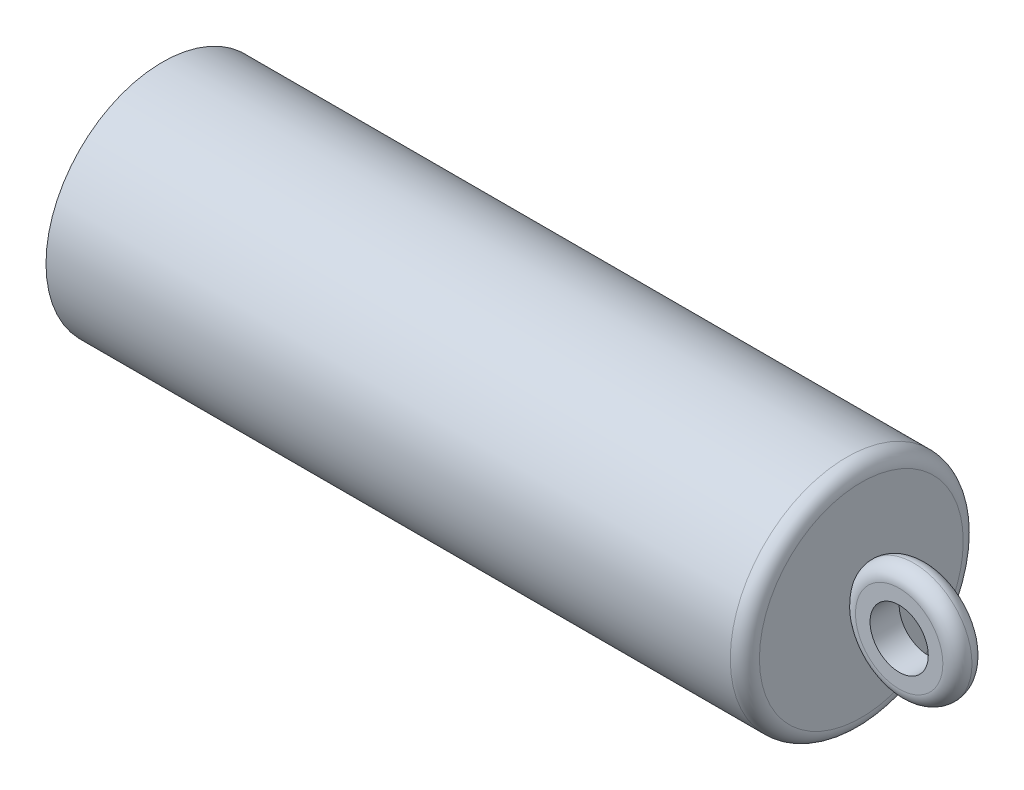
ISO-10303-21;
HEADER;
FILE_DESCRIPTION(('STEP AP214'),'2;1');
FILE_NAME('part.step','',(''),(''),'','','');
FILE_SCHEMA(('AUTOMOTIVE_DESIGN { 1 0 10303 214 1 1 1 1 }'));
ENDSEC;
DATA;
#1=APPLICATION_CONTEXT('core data for automotive mechanical design processes');
#2=APPLICATION_PROTOCOL_DEFINITION('international standard','automotive_design',2000,#1);
#3=PRODUCT_CONTEXT('',#1,'mechanical');
#4=PRODUCT('Part','Part','',(#3));
#5=PRODUCT_RELATED_PRODUCT_CATEGORY('part','',(#4));
#6=PRODUCT_DEFINITION_FORMATION('','',#4);
#7=PRODUCT_DEFINITION_CONTEXT('part definition',#1,'design');
#8=PRODUCT_DEFINITION('design','',#6,#7);
#9=PRODUCT_DEFINITION_SHAPE('','',#8);
#10=(LENGTH_UNIT() NAMED_UNIT(*) SI_UNIT(.MILLI.,.METRE.));
#11=(NAMED_UNIT(*) PLANE_ANGLE_UNIT() SI_UNIT($,.RADIAN.));
#12=(NAMED_UNIT(*) SI_UNIT($,.STERADIAN.) SOLID_ANGLE_UNIT());
#13=UNCERTAINTY_MEASURE_WITH_UNIT(LENGTH_MEASURE(1.E-05),#10,'distance_accuracy_value','');
#14=(GEOMETRIC_REPRESENTATION_CONTEXT(3) GLOBAL_UNCERTAINTY_ASSIGNED_CONTEXT((#13)) GLOBAL_UNIT_ASSIGNED_CONTEXT((#10,
#11,#12)) REPRESENTATION_CONTEXT('',''));
#15=CARTESIAN_POINT('',(0.,0.,0.));
#16=DIRECTION('',(0.,0.,1.));
#17=DIRECTION('',(1.,0.,0.));
#18=AXIS2_PLACEMENT_3D('',#15,#16,#17);
#19=CARTESIAN_POINT('',(76.2,0.,0.));
#20=DIRECTION('',(1.,0.,0.));
#21=DIRECTION('',(0.,0.,-1.));
#22=AXIS2_PLACEMENT_3D('',#19,#20,#21);
#23=PLANE('',#22);
#24=CARTESIAN_POINT('',(76.2,0.,0.));
#25=DIRECTION('',(1.,0.,0.));
#26=DIRECTION('',(0.,0.,-1.));
#27=AXIS2_PLACEMENT_3D('',#24,#25,#26);
#28=CIRCLE('',#27,11.1125);
#29=CARTESIAN_POINT('',(76.2,0.,-11.1125));
#30=VERTEX_POINT('',#29);
#31=EDGE_CURVE('E57',#30,#30,#28,.T.);
#32=ORIENTED_EDGE('',*,*,#31,.T.);
#33=EDGE_LOOP('',(#32));
#34=FACE_BOUND('',#33,.T.);
#35=CARTESIAN_POINT('',(76.2,2.76790082914832,0.));
#36=CARTESIAN_POINT('',(76.2,2.76799560286683,-0.0415321876434481));
#37=CARTESIAN_POINT('',(76.2,2.76416781145411,-0.0829644315915624));
#38=CARTESIAN_POINT('',(76.2,2.74948889415519,-0.164226781417078));
#39=CARTESIAN_POINT('',(76.2,2.73869624027987,-0.204067319753549));
#40=CARTESIAN_POINT('',(76.2,2.71092263365801,-0.281363831155004));
#41=CARTESIAN_POINT('',(76.2,2.69395832136879,-0.318825901160992));
#42=CARTESIAN_POINT('',(76.2,2.65489162105821,-0.391020376587939));
#43=CARTESIAN_POINT('',(76.2,2.63277833716207,-0.425746781469106));
#44=CARTESIAN_POINT('',(76.2,2.56964424453132,-0.512552843849354));
#45=CARTESIAN_POINT('',(76.2,2.52533675661912,-0.562238950960838));
#46=CARTESIAN_POINT('',(76.2,2.42954221481172,-0.654131737730224));
#47=CARTESIAN_POINT('',(76.2,2.37803556003017,-0.696317258350174));
#48=CARTESIAN_POINT('',(76.2,2.27861936488134,-0.767991133814682));
#49=CARTESIAN_POINT('',(76.2,2.23138481151806,-0.79843418670752));
#50=CARTESIAN_POINT('',(76.2,2.13444642103697,-0.855130162307362));
#51=CARTESIAN_POINT('',(76.2,2.08474077585683,-0.881379955894404));
#52=CARTESIAN_POINT('',(76.2,1.93294942020491,-0.954655981478679));
#53=CARTESIAN_POINT('',(76.2,1.8282159172078,-0.996190899989502));
#54=CARTESIAN_POINT('',(76.2,1.61061781601046,-1.06953658436386));
#55=CARTESIAN_POINT('',(76.2,1.49759685622132,-1.10085845222127));
#56=CARTESIAN_POINT('',(76.2,1.26927640506119,-1.15410300641251));
#57=CARTESIAN_POINT('',(76.2,1.1539743988134,-1.17601463538036));
#58=CARTESIAN_POINT('',(76.2,0.9214618684825,-1.21241264685751));
#59=CARTESIAN_POINT('',(76.2,0.804243760725039,-1.22684886686397));
#60=CARTESIAN_POINT('',(76.2,0.569181000146357,-1.24935468815828));
#61=CARTESIAN_POINT('',(76.2,0.451336187377502,-1.25742257703634));
#62=CARTESIAN_POINT('',(76.2,0.242786874575787,-1.26667361586332));
#63=CARTESIAN_POINT('',(76.2,0.152130646268465,-1.26902000094558));
#64=CARTESIAN_POINT('',(76.2,-0.0292088042139721,-1.2704841516312));
#65=CARTESIAN_POINT('',(76.2,-0.119892026226398,-1.26960193631424));
#66=CARTESIAN_POINT('',(76.2,-0.30134091858514,-1.26456004880577));
#67=CARTESIAN_POINT('',(76.2,-0.392106417896345,-1.26039414862958));
#68=CARTESIAN_POINT('',(76.2,-0.573411739003937,-1.24855946078096));
#69=CARTESIAN_POINT('',(76.2,-0.663951564191378,-1.24089072606623));
#70=CARTESIAN_POINT('',(76.2,-0.843782925932682,-1.22174061328743));
#71=CARTESIAN_POINT('',(76.2,-0.933078243580617,-1.21029533063305));
#72=CARTESIAN_POINT('',(76.2,-1.1109883135871,-1.18299318191941));
#73=CARTESIAN_POINT('',(76.2,-1.19960318937125,-1.16713713633128));
#74=CARTESIAN_POINT('',(76.2,-1.37548673251317,-1.13025804437464));
#75=CARTESIAN_POINT('',(76.2,-1.46275866898305,-1.10925082344005));
#76=CARTESIAN_POINT('',(76.2,-1.63552957716925,-1.06098413422175));
#77=CARTESIAN_POINT('',(76.2,-1.72102994824575,-1.03372982315037));
#78=CARTESIAN_POINT('',(76.2,-1.85075526846275,-0.98576213937214));
#79=CARTESIAN_POINT('',(76.2,-1.8959788404973,-0.967755368105917));
#80=CARTESIAN_POINT('',(76.2,-1.98532831597325,-0.929195802063028));
#81=CARTESIAN_POINT('',(76.2,-2.02945393175505,-0.908642348327991));
#82=CARTESIAN_POINT('',(76.2,-2.15956714981768,-0.842764729896043));
#83=CARTESIAN_POINT('',(76.2,-2.24352707269196,-0.793140348080618));
#84=CARTESIAN_POINT('',(76.2,-2.37289094164626,-0.700119782102055));
#85=CARTESIAN_POINT('',(76.2,-2.42129556276146,-0.660910436100965));
#86=CARTESIAN_POINT('',(76.2,-2.51203188095016,-0.575887930908315));
#87=CARTESIAN_POINT('',(76.2,-2.5543687675523,-0.530080482906826));
#88=CARTESIAN_POINT('',(76.2,-2.62100004979763,-0.443470264995463));
#89=CARTESIAN_POINT('',(76.2,-2.64718241414173,-0.404131243586423));
#90=CARTESIAN_POINT('',(76.2,-2.69284269597761,-0.32181817755703));
#91=CARTESIAN_POINT('',(76.2,-2.71234205951215,-0.278856322476531));
#92=CARTESIAN_POINT('',(76.2,-2.74078200633685,-0.196772694618342));
#93=CARTESIAN_POINT('',(76.2,-2.75087398032979,-0.158053820906672));
#94=CARTESIAN_POINT('',(76.2,-2.76453992545542,-0.0791569362025066));
#95=CARTESIAN_POINT('',(76.2,-2.76805787855344,-0.0389693336582958));
#96=CARTESIAN_POINT('',(76.2,-2.76789959955555,0.00130449025609065));
#97=B_SPLINE_CURVE_WITH_KNOTS('',3,(#35,#36,#37,#38,#39,#40,#41,#42,#43,#44,#45,#46,#47,#48,#49,
#50,#51,#52,#53,#54,#55,#56,#57,#58,#59,#60,#61,#62,#63,#64,#65,#66,#67,#68,#69,#70,#71,#72,#73,
#74,#75,#76,#77,#78,#79,#80,#81,#82,#83,#84,#85,#86,#87,#88,#89,#90,#91,#92,#93,#94,#95,#96),
.UNSPECIFIED.,.F.,.F.,(4,2,2,2,2,2,2,2,2,2,2,2,2,2,2,2,2,2,2,2,2,2,2,2,2,2,2,2,2,2,4),(0.,
0.124261713583793,0.247493551693659,0.37039555662096,0.49356004006834,0.692136305396511,
0.891264157894348,1.05960632601172,1.22807353448833,1.56510327522126,1.91647201058696,
2.26825249454583,2.62236391312058,2.97657051793333,3.24857618101382,3.52058023665632,
3.79310143243027,4.06561850822188,4.33560292819439,4.60553716037214,4.87465226868301,
5.14354600724305,5.28950007044011,5.43549197867349,5.72672960790751,5.91314470104518,
6.09939939584694,6.24066504465603,6.38147302547113,6.50097008815845,6.62148083701414),.UNSPECIFIED.);
#98=CARTESIAN_POINT('',(76.2,2.76790082914832,0.));
#99=VERTEX_POINT('',#98);
#100=CARTESIAN_POINT('',(76.2,-2.76790082914832,0.));
#101=VERTEX_POINT('',#100);
#102=EDGE_CURVE('E76',#99,#101,#97,.T.);
#103=ORIENTED_EDGE('',*,*,#102,.T.);
#104=CARTESIAN_POINT('',(76.2,-2.76790082914832,0.));
#105=CARTESIAN_POINT('',(76.2,-2.76799560286683,0.0415321876434481));
#106=CARTESIAN_POINT('',(76.2,-2.76416781145411,0.0829644315915624));
#107=CARTESIAN_POINT('',(76.2,-2.74948889415519,0.164226781417078));
#108=CARTESIAN_POINT('',(76.2,-2.73869624027987,0.204067319753549));
#109=CARTESIAN_POINT('',(76.2,-2.71092263365801,0.281363831155004));
#110=CARTESIAN_POINT('',(76.2,-2.69395832136879,0.318825901160992));
#111=CARTESIAN_POINT('',(76.2,-2.65489162105821,0.391020376587939));
#112=CARTESIAN_POINT('',(76.2,-2.63277833716207,0.425746781469106));
#113=CARTESIAN_POINT('',(76.2,-2.56964424453132,0.512552843849354));
#114=CARTESIAN_POINT('',(76.2,-2.52533675661912,0.562238950960838));
#115=CARTESIAN_POINT('',(76.2,-2.42954221481172,0.654131737730224));
#116=CARTESIAN_POINT('',(76.2,-2.37803556003017,0.696317258350174));
#117=CARTESIAN_POINT('',(76.2,-2.27861936488134,0.767991133814682));
#118=CARTESIAN_POINT('',(76.2,-2.23138481151806,0.79843418670752));
#119=CARTESIAN_POINT('',(76.2,-2.13444642103697,0.855130162307362));
#120=CARTESIAN_POINT('',(76.2,-2.08474077585683,0.881379955894404));
#121=CARTESIAN_POINT('',(76.2,-1.93294942020491,0.954655981478679));
#122=CARTESIAN_POINT('',(76.2,-1.8282159172078,0.996190899989502));
#123=CARTESIAN_POINT('',(76.2,-1.61061781601046,1.06953658436386));
#124=CARTESIAN_POINT('',(76.2,-1.49759685622132,1.10085845222127));
#125=CARTESIAN_POINT('',(76.2,-1.26927640506119,1.15410300641251));
#126=CARTESIAN_POINT('',(76.2,-1.1539743988134,1.17601463538036));
#127=CARTESIAN_POINT('',(76.2,-0.9214618684825,1.21241264685751));
#128=CARTESIAN_POINT('',(76.2,-0.804243760725039,1.22684886686397));
#129=CARTESIAN_POINT('',(76.2,-0.569181000146357,1.24935468815828));
#130=CARTESIAN_POINT('',(76.2,-0.451336187377502,1.25742257703634));
#131=CARTESIAN_POINT('',(76.2,-0.242786874575787,1.26667361586332));
#132=CARTESIAN_POINT('',(76.2,-0.152130646268465,1.26902000094558));
#133=CARTESIAN_POINT('',(76.2,0.0292088042139721,1.2704841516312));
#134=CARTESIAN_POINT('',(76.2,0.119892026226398,1.26960193631424));
#135=CARTESIAN_POINT('',(76.2,0.30134091858514,1.26456004880577));
#136=CARTESIAN_POINT('',(76.2,0.392106417896345,1.26039414862958));
#137=CARTESIAN_POINT('',(76.2,0.573411739003937,1.24855946078096));
#138=CARTESIAN_POINT('',(76.2,0.663951564191378,1.24089072606623));
#139=CARTESIAN_POINT('',(76.2,0.843782925932682,1.22174061328743));
#140=CARTESIAN_POINT('',(76.2,0.933078243580617,1.21029533063305));
#141=CARTESIAN_POINT('',(76.2,1.1109883135871,1.18299318191941));
#142=CARTESIAN_POINT('',(76.2,1.19960318937125,1.16713713633128));
#143=CARTESIAN_POINT('',(76.2,1.37548673251317,1.13025804437464));
#144=CARTESIAN_POINT('',(76.2,1.46275866898305,1.10925082344005));
#145=CARTESIAN_POINT('',(76.2,1.63552957716925,1.06098413422175));
#146=CARTESIAN_POINT('',(76.2,1.72102994824575,1.03372982315037));
#147=CARTESIAN_POINT('',(76.2,1.85075526846275,0.98576213937214));
#148=CARTESIAN_POINT('',(76.2,1.8959788404973,0.967755368105917));
#149=CARTESIAN_POINT('',(76.2,1.98532831597325,0.929195802063028));
#150=CARTESIAN_POINT('',(76.2,2.02945393175505,0.908642348327991));
#151=CARTESIAN_POINT('',(76.2,2.15956714981768,0.842764729896043));
#152=CARTESIAN_POINT('',(76.2,2.24352707269196,0.793140348080618));
#153=CARTESIAN_POINT('',(76.2,2.37289094164626,0.700119782102055));
#154=CARTESIAN_POINT('',(76.2,2.42129556276146,0.660910436100965));
#155=CARTESIAN_POINT('',(76.2,2.51203188095016,0.575887930908315));
#156=CARTESIAN_POINT('',(76.2,2.5543687675523,0.530080482906826));
#157=CARTESIAN_POINT('',(76.2,2.62100004979763,0.443470264995463));
#158=CARTESIAN_POINT('',(76.2,2.64718241414173,0.404131243586423));
#159=CARTESIAN_POINT('',(76.2,2.69284269597761,0.32181817755703));
#160=CARTESIAN_POINT('',(76.2,2.71234205951215,0.278856322476531));
#161=CARTESIAN_POINT('',(76.2,2.74078200633685,0.196772694618342));
#162=CARTESIAN_POINT('',(76.2,2.75087398032979,0.158053820906672));
#163=CARTESIAN_POINT('',(76.2,2.76453992545542,0.0791569362025066));
#164=CARTESIAN_POINT('',(76.2,2.76805787855344,0.0389693336582958));
#165=CARTESIAN_POINT('',(76.2,2.76789959955555,-0.00130449025609065));
#166=B_SPLINE_CURVE_WITH_KNOTS('',3,(#104,#105,#106,#107,#108,#109,#110,#111,#112,#113,#114,
#115,#116,#117,#118,#119,#120,#121,#122,#123,#124,#125,#126,#127,#128,#129,#130,#131,#132,#133,
#134,#135,#136,#137,#138,#139,#140,#141,#142,#143,#144,#145,#146,#147,#148,#149,#150,#151,#152,
#153,#154,#155,#156,#157,#158,#159,#160,#161,#162,#163,#164,#165),.UNSPECIFIED.,.F.,.F.,(4,2,2,
2,2,2,2,2,2,2,2,2,2,2,2,2,2,2,2,2,2,2,2,2,2,2,2,2,2,2,4),(0.,0.124261713583793,
0.247493551693659,0.37039555662096,0.49356004006834,0.692136305396511,0.891264157894348,
1.05960632601172,1.22807353448833,1.56510327522126,1.91647201058696,2.26825249454583,
2.62236391312058,2.97657051793333,3.24857618101382,3.52058023665632,3.79310143243027,
4.06561850822188,4.33560292819439,4.60553716037214,4.87465226868301,5.14354600724305,
5.28950007044011,5.43549197867349,5.72672960790751,5.91314470104518,6.09939939584694,
6.24066504465603,6.38147302547113,6.50097008815845,6.62148083701414),.UNSPECIFIED.);
#167=EDGE_CURVE('E71',#101,#99,#166,.T.);
#168=ORIENTED_EDGE('',*,*,#167,.T.);
#169=EDGE_LOOP('',(#103,#168));
#170=FACE_BOUND('',#169,.T.);
#171=ADVANCED_FACE('F50',(#34,#170),#23,.T.);
#172=CARTESIAN_POINT('',(76.2,0.,0.));
#173=DIRECTION('',(-1.,0.,0.));
#174=DIRECTION('',(0.,0.,1.));
#175=AXIS2_PLACEMENT_3D('',#172,#173,#174);
#176=CYLINDRICAL_SURFACE('',#175,12.7);
#177=CARTESIAN_POINT('',(74.6125,0.,0.));
#178=DIRECTION('',(1.,0.,0.));
#179=DIRECTION('',(0.,0.,-1.));
#180=AXIS2_PLACEMENT_3D('',#177,#178,#179);
#181=CIRCLE('',#180,12.7);
#182=CARTESIAN_POINT('',(74.6125,0.,12.7));
#183=VERTEX_POINT('',#182);
#184=EDGE_CURVE('E11',#183,#183,#181,.F.);
#185=CARTESIAN_POINT('',(0.,0.,0.));
#186=DIRECTION('',(1.,0.,0.));
#187=DIRECTION('',(0.,0.,-1.));
#188=AXIS2_PLACEMENT_3D('',#185,#186,#187);
#189=CIRCLE('',#188,12.7);
#190=CARTESIAN_POINT('',(0.,0.,12.7));
#191=VERTEX_POINT('',#190);
#192=EDGE_CURVE('E130',#191,#191,#189,.T.);
#193=CARTESIAN_POINT('',(74.6125,0.,12.7));
#194=CARTESIAN_POINT('',(73.8352864583333,0.,12.7));
#195=CARTESIAN_POINT('',(73.0580729166667,0.,12.7));
#196=CARTESIAN_POINT('',(71.5036458333333,0.,12.7));
#197=CARTESIAN_POINT('',(70.7264322916667,0.,12.7));
#198=CARTESIAN_POINT('',(69.1720052083333,0.,12.7));
#199=CARTESIAN_POINT('',(68.3947916666667,0.,12.7));
#200=CARTESIAN_POINT('',(66.8403645833333,0.,12.7));
#201=CARTESIAN_POINT('',(66.0631510416667,0.,12.7));
#202=CARTESIAN_POINT('',(64.5087239583333,0.,12.7));
#203=CARTESIAN_POINT('',(63.7315104166667,0.,12.7));
#204=CARTESIAN_POINT('',(62.1770833333333,0.,12.7));
#205=CARTESIAN_POINT('',(61.3998697916667,0.,12.7));
#206=CARTESIAN_POINT('',(59.8454427083333,0.,12.7));
#207=CARTESIAN_POINT('',(59.0682291666667,0.,12.7));
#208=CARTESIAN_POINT('',(57.5138020833333,0.,12.7));
#209=CARTESIAN_POINT('',(56.7365885416667,0.,12.7));
#210=CARTESIAN_POINT('',(55.1821614583333,0.,12.7));
#211=CARTESIAN_POINT('',(54.4049479166667,0.,12.7));
#212=CARTESIAN_POINT('',(52.8505208333333,0.,12.7));
#213=CARTESIAN_POINT('',(52.0733072916667,0.,12.7));
#214=CARTESIAN_POINT('',(50.5188802083333,0.,12.7));
#215=CARTESIAN_POINT('',(49.7416666666667,0.,12.7));
#216=CARTESIAN_POINT('',(48.1872395833333,0.,12.7));
#217=CARTESIAN_POINT('',(47.4100260416667,0.,12.7));
#218=CARTESIAN_POINT('',(45.8555989583333,0.,12.7));
#219=CARTESIAN_POINT('',(45.0783854166667,0.,12.7));
#220=CARTESIAN_POINT('',(43.5239583333333,0.,12.7));
#221=CARTESIAN_POINT('',(42.7467447916667,0.,12.7));
#222=CARTESIAN_POINT('',(41.1923177083333,0.,12.7));
#223=CARTESIAN_POINT('',(40.4151041666667,0.,12.7));
#224=CARTESIAN_POINT('',(38.8606770833333,0.,12.7));
#225=CARTESIAN_POINT('',(38.0834635416667,0.,12.7));
#226=CARTESIAN_POINT('',(36.5290364583333,0.,12.7));
#227=CARTESIAN_POINT('',(35.7518229166667,0.,12.7));
#228=CARTESIAN_POINT('',(34.1973958333333,0.,12.7));
#229=CARTESIAN_POINT('',(33.4201822916667,0.,12.7));
#230=CARTESIAN_POINT('',(31.8657552083333,0.,12.7));
#231=CARTESIAN_POINT('',(31.0885416666667,0.,12.7));
#232=CARTESIAN_POINT('',(29.5341145833333,0.,12.7));
#233=CARTESIAN_POINT('',(28.7569010416667,0.,12.7));
#234=CARTESIAN_POINT('',(27.2024739583333,0.,12.7));
#235=CARTESIAN_POINT('',(26.4252604166667,0.,12.7));
#236=CARTESIAN_POINT('',(24.8708333333333,0.,12.7));
#237=CARTESIAN_POINT('',(24.0936197916667,0.,12.7));
#238=CARTESIAN_POINT('',(22.5391927083333,0.,12.7));
#239=CARTESIAN_POINT('',(21.7619791666667,0.,12.7));
#240=CARTESIAN_POINT('',(20.2075520833333,0.,12.7));
#241=CARTESIAN_POINT('',(19.4303385416667,0.,12.7));
#242=CARTESIAN_POINT('',(17.8759114583333,0.,12.7));
#243=CARTESIAN_POINT('',(17.0986979166667,0.,12.7));
#244=CARTESIAN_POINT('',(15.5442708333333,0.,12.7));
#245=CARTESIAN_POINT('',(14.7670572916667,0.,12.7));
#246=CARTESIAN_POINT('',(13.2126302083333,0.,12.7));
#247=CARTESIAN_POINT('',(12.4354166666667,0.,12.7));
#248=CARTESIAN_POINT('',(10.8809895833333,0.,12.7));
#249=CARTESIAN_POINT('',(10.1037760416667,0.,12.7));
#250=CARTESIAN_POINT('',(8.54934895833333,0.,12.7));
#251=CARTESIAN_POINT('',(7.77213541666667,0.,12.7));
#252=CARTESIAN_POINT('',(6.21770833333334,0.,12.7));
#253=CARTESIAN_POINT('',(5.44049479166667,0.,12.7));
#254=CARTESIAN_POINT('',(3.88606770833333,0.,12.7));
#255=CARTESIAN_POINT('',(3.10885416666667,0.,12.7));
#256=CARTESIAN_POINT('',(1.55442708333334,0.,12.7));
#257=CARTESIAN_POINT('',(0.777213541666668,0.,12.7));
#258=CARTESIAN_POINT('',(0.,0.,12.7));
#259=B_SPLINE_CURVE_WITH_KNOTS('',3,(#193,#194,#195,#196,#197,#198,#199,#200,#201,#202,#203,
#204,#205,#206,#207,#208,#209,#210,#211,#212,#213,#214,#215,#216,#217,#218,#219,#220,#221,#222,
#223,#224,#225,#226,#227,#228,#229,#230,#231,#232,#233,#234,#235,#236,#237,#238,#239,#240,#241,
#242,#243,#244,#245,#246,#247,#248,#249,#250,#251,#252,#253,#254,#255,#256,#257,#258),
.UNSPECIFIED.,.F.,.F.,(4,2,2,2,2,2,2,2,2,2,2,2,2,2,2,2,2,2,2,2,2,2,2,2,2,2,2,2,2,2,2,2,4),(0.,
2.33164062499999,4.66328125,6.99492187499999,9.3265625,11.658203125,13.98984375,16.321484375,
18.653125,20.984765625,23.31640625,25.648046875,27.9796875,30.311328125,32.64296875,
34.974609375,37.30625,39.637890625,41.96953125,44.301171875,46.6328125,48.964453125,51.29609375,
53.627734375,55.959375,58.291015625,60.62265625,62.954296875,65.2859375,67.617578125,
69.94921875,72.280859375,74.6125),.UNSPECIFIED.);
#260=EDGE_CURVE('BSEAM109',#183,#191,#259,.T.);
#261=ORIENTED_EDGE('',*,*,#184,.T.);
#262=ORIENTED_EDGE('',*,*,#192,.T.);
#263=ORIENTED_EDGE('',*,*,#260,.T.);
#264=ORIENTED_EDGE('',*,*,#260,.F.);
#265=EDGE_LOOP('',(#261,#263,#262,#264));
#266=FACE_BOUND('',#265,.T.);
#267=ADVANCED_FACE('F109',(#266),#176,.T.);
#268=CARTESIAN_POINT('',(0.,0.,0.));
#269=DIRECTION('',(1.,0.,0.));
#270=DIRECTION('',(0.,0.,-1.));
#271=AXIS2_PLACEMENT_3D('',#268,#269,#270);
#272=PLANE('',#271);
#273=CARTESIAN_POINT('',(0.,0.,0.));
#274=DIRECTION('',(1.,0.,0.));
#275=DIRECTION('',(0.,0.,-1.));
#276=AXIS2_PLACEMENT_3D('',#273,#274,#275);
#277=CIRCLE('',#276,6.35);
#278=CARTESIAN_POINT('',(0.,0.,6.35));
#279=VERTEX_POINT('',#278);
#280=EDGE_CURVE('E138',#279,#279,#277,.T.);
#281=ORIENTED_EDGE('',*,*,#280,.T.);
#282=EDGE_LOOP('',(#281));
#283=FACE_BOUND('',#282,.T.);
#284=ORIENTED_EDGE('',*,*,#192,.F.);
#285=EDGE_LOOP('',(#284));
#286=FACE_BOUND('',#285,.T.);
#287=ADVANCED_FACE('F112',(#283,#286),#272,.F.);
#288=CARTESIAN_POINT('',(76.2,0.,0.));
#289=DIRECTION('',(-1.,0.,0.));
#290=DIRECTION('',(0.,0.,1.));
#291=AXIS2_PLACEMENT_3D('',#288,#289,#290);
#292=CYLINDRICAL_SURFACE('',#291,6.35);
#293=CARTESIAN_POINT('',(69.85,0.,0.));
#294=DIRECTION('',(1.,0.,0.));
#295=DIRECTION('',(0.,0.,-1.));
#296=AXIS2_PLACEMENT_3D('',#293,#294,#295);
#297=CIRCLE('',#296,6.35);
#298=CARTESIAN_POINT('',(69.85,0.,6.35));
#299=VERTEX_POINT('',#298);
#300=EDGE_CURVE('E132',#299,#299,#297,.T.);
#301=CARTESIAN_POINT('',(69.85,0.,6.35));
#302=CARTESIAN_POINT('',(69.1223958333333,0.,6.35));
#303=CARTESIAN_POINT('',(68.3947916666667,0.,6.35));
#304=CARTESIAN_POINT('',(66.9395833333333,0.,6.35));
#305=CARTESIAN_POINT('',(66.2119791666667,0.,6.35));
#306=CARTESIAN_POINT('',(64.7567708333333,0.,6.35));
#307=CARTESIAN_POINT('',(64.0291666666667,0.,6.35));
#308=CARTESIAN_POINT('',(62.5739583333333,0.,6.35));
#309=CARTESIAN_POINT('',(61.8463541666667,0.,6.35));
#310=CARTESIAN_POINT('',(60.3911458333333,0.,6.35));
#311=CARTESIAN_POINT('',(59.6635416666667,0.,6.35));
#312=CARTESIAN_POINT('',(58.2083333333333,0.,6.35));
#313=CARTESIAN_POINT('',(57.4807291666667,0.,6.35));
#314=CARTESIAN_POINT('',(56.0255208333333,0.,6.35));
#315=CARTESIAN_POINT('',(55.2979166666667,0.,6.35));
#316=CARTESIAN_POINT('',(53.8427083333333,0.,6.35));
#317=CARTESIAN_POINT('',(53.1151041666667,0.,6.35));
#318=CARTESIAN_POINT('',(51.6598958333333,0.,6.35));
#319=CARTESIAN_POINT('',(50.9322916666667,0.,6.35));
#320=CARTESIAN_POINT('',(49.4770833333333,0.,6.35));
#321=CARTESIAN_POINT('',(48.7494791666667,0.,6.35));
#322=CARTESIAN_POINT('',(47.2942708333333,0.,6.35));
#323=CARTESIAN_POINT('',(46.5666666666667,0.,6.35));
#324=CARTESIAN_POINT('',(45.1114583333333,0.,6.35));
#325=CARTESIAN_POINT('',(44.3838541666667,0.,6.35));
#326=CARTESIAN_POINT('',(42.9286458333333,0.,6.35));
#327=CARTESIAN_POINT('',(42.2010416666667,0.,6.35));
#328=CARTESIAN_POINT('',(40.7458333333333,0.,6.35));
#329=CARTESIAN_POINT('',(40.0182291666667,0.,6.35));
#330=CARTESIAN_POINT('',(38.5630208333333,0.,6.35));
#331=CARTESIAN_POINT('',(37.8354166666667,0.,6.35));
#332=CARTESIAN_POINT('',(36.3802083333333,0.,6.35));
#333=CARTESIAN_POINT('',(35.6526041666667,0.,6.35));
#334=CARTESIAN_POINT('',(34.1973958333333,0.,6.35));
#335=CARTESIAN_POINT('',(33.4697916666667,0.,6.35));
#336=CARTESIAN_POINT('',(32.0145833333333,0.,6.35));
#337=CARTESIAN_POINT('',(31.2869791666667,0.,6.35));
#338=CARTESIAN_POINT('',(29.8317708333333,0.,6.35));
#339=CARTESIAN_POINT('',(29.1041666666667,0.,6.35));
#340=CARTESIAN_POINT('',(27.6489583333333,0.,6.35));
#341=CARTESIAN_POINT('',(26.9213541666667,0.,6.35));
#342=CARTESIAN_POINT('',(25.4661458333333,0.,6.35));
#343=CARTESIAN_POINT('',(24.7385416666667,0.,6.35));
#344=CARTESIAN_POINT('',(23.2833333333333,0.,6.35));
#345=CARTESIAN_POINT('',(22.5557291666667,0.,6.35));
#346=CARTESIAN_POINT('',(21.1005208333333,0.,6.35));
#347=CARTESIAN_POINT('',(20.3729166666667,0.,6.35));
#348=CARTESIAN_POINT('',(18.9177083333333,0.,6.35));
#349=CARTESIAN_POINT('',(18.1901041666667,0.,6.35));
#350=CARTESIAN_POINT('',(16.7348958333333,0.,6.35));
#351=CARTESIAN_POINT('',(16.0072916666667,0.,6.35));
#352=CARTESIAN_POINT('',(14.5520833333333,0.,6.35));
#353=CARTESIAN_POINT('',(13.8244791666667,0.,6.35));
#354=CARTESIAN_POINT('',(12.3692708333333,0.,6.35));
#355=CARTESIAN_POINT('',(11.6416666666667,0.,6.35));
#356=CARTESIAN_POINT('',(10.1864583333333,0.,6.35));
#357=CARTESIAN_POINT('',(9.45885416666666,0.,6.35));
#358=CARTESIAN_POINT('',(8.00364583333333,0.,6.35));
#359=CARTESIAN_POINT('',(7.27604166666667,0.,6.35));
#360=CARTESIAN_POINT('',(5.82083333333333,0.,6.35));
#361=CARTESIAN_POINT('',(5.09322916666666,0.,6.35));
#362=CARTESIAN_POINT('',(3.63802083333332,0.,6.35));
#363=CARTESIAN_POINT('',(2.91041666666666,0.,6.35));
#364=CARTESIAN_POINT('',(1.45520833333333,0.,6.35));
#365=CARTESIAN_POINT('',(0.727604166666664,0.,6.35));
#366=CARTESIAN_POINT('',(0.,0.,6.35));
#367=B_SPLINE_CURVE_WITH_KNOTS('',3,(#301,#302,#303,#304,#305,#306,#307,#308,#309,#310,#311,
#312,#313,#314,#315,#316,#317,#318,#319,#320,#321,#322,#323,#324,#325,#326,#327,#328,#329,#330,
#331,#332,#333,#334,#335,#336,#337,#338,#339,#340,#341,#342,#343,#344,#345,#346,#347,#348,#349,
#350,#351,#352,#353,#354,#355,#356,#357,#358,#359,#360,#361,#362,#363,#364,#365,#366),
.UNSPECIFIED.,.F.,.F.,(4,2,2,2,2,2,2,2,2,2,2,2,2,2,2,2,2,2,2,2,2,2,2,2,2,2,2,2,2,2,2,2,4),(0.,
2.18281250000001,4.36562500000001,6.5484375,8.73125000000001,10.9140625,13.096875,15.2796875,
17.4625,19.6453125,21.828125,24.0109375,26.19375,28.3765625,30.559375,32.7421875,34.925,
37.1078125,39.290625,41.4734375,43.65625,45.8390625,48.021875,50.2046875,52.3875,54.5703125,
56.753125,58.9359375,61.11875,63.3015625,65.484375,67.6671875,69.85),.UNSPECIFIED.);
#368=EDGE_CURVE('BSEAM120',#299,#279,#367,.T.);
#369=ORIENTED_EDGE('',*,*,#300,.T.);
#370=ORIENTED_EDGE('',*,*,#280,.F.);
#371=ORIENTED_EDGE('',*,*,#368,.T.);
#372=ORIENTED_EDGE('',*,*,#368,.F.);
#373=EDGE_LOOP('',(#369,#371,#370,#372));
#374=FACE_BOUND('',#373,.T.);
#375=ADVANCED_FACE('F120',(#374),#292,.F.);
#376=CARTESIAN_POINT('',(69.85,0.,0.));
#377=DIRECTION('',(1.,0.,0.));
#378=DIRECTION('',(0.,0.,-1.));
#379=AXIS2_PLACEMENT_3D('',#376,#377,#378);
#380=PLANE('',#379);
#381=ORIENTED_EDGE('',*,*,#300,.F.);
#382=EDGE_LOOP('',(#381));
#383=FACE_BOUND('',#382,.T.);
#384=ADVANCED_FACE('F115',(#383),#380,.F.);
#385=CARTESIAN_POINT('',(81.915,0.,1.5875));
#386=DIRECTION('',(0.,0.,1.));
#387=DIRECTION('',(1.,0.,0.));
#388=AXIS2_PLACEMENT_3D('',#385,#386,#387);
#389=PLANE('',#388);
#390=CARTESIAN_POINT('',(81.915,0.,1.5875));
#391=DIRECTION('',(0.,0.,1.));
#392=DIRECTION('',(1.,0.,0.));
#393=AXIS2_PLACEMENT_3D('',#390,#391,#392);
#394=CIRCLE('',#393,4.7625);
#395=CARTESIAN_POINT('',(77.62875,-2.07592562186124,1.5875));
#396=VERTEX_POINT('',#395);
#397=EDGE_CURVE('E64',#396,#396,#394,.T.);
#398=ORIENTED_EDGE('',*,*,#397,.T.);
#399=EDGE_LOOP('',(#398));
#400=FACE_BOUND('',#399,.T.);
#401=CARTESIAN_POINT('',(81.915,0.,1.5875));
#402=DIRECTION('',(0.,0.,1.));
#403=DIRECTION('',(1.,0.,0.));
#404=AXIS2_PLACEMENT_3D('',#401,#402,#403);
#405=CIRCLE('',#404,3.175);
#406=CARTESIAN_POINT('',(85.09,0.,1.5875));
#407=VERTEX_POINT('',#406);
#408=EDGE_CURVE('E142',#407,#407,#405,.T.);
#409=ORIENTED_EDGE('',*,*,#408,.F.);
#410=EDGE_LOOP('',(#409));
#411=FACE_BOUND('',#410,.T.);
#412=ADVANCED_FACE('F154',(#400,#411),#389,.T.);
#413=CARTESIAN_POINT('',(81.915,0.,-1.5875));
#414=DIRECTION('',(0.,0.,1.));
#415=DIRECTION('',(1.,0.,0.));
#416=AXIS2_PLACEMENT_3D('',#413,#414,#415);
#417=PLANE('',#416);
#418=CARTESIAN_POINT('',(81.915,0.,-1.5875));
#419=DIRECTION('',(0.,0.,1.));
#420=DIRECTION('',(1.,0.,0.));
#421=AXIS2_PLACEMENT_3D('',#418,#419,#420);
#422=CIRCLE('',#421,4.7625);
#423=CARTESIAN_POINT('',(77.62875,-2.07592562186124,-1.5875));
#424=VERTEX_POINT('',#423);
#425=EDGE_CURVE('E67',#424,#424,#422,.F.);
#426=ORIENTED_EDGE('',*,*,#425,.T.);
#427=EDGE_LOOP('',(#426));
#428=FACE_BOUND('',#427,.T.);
#429=CARTESIAN_POINT('',(81.915,0.,-1.5875));
#430=DIRECTION('',(0.,0.,1.));
#431=DIRECTION('',(1.,0.,0.));
#432=AXIS2_PLACEMENT_3D('',#429,#430,#431);
#433=CIRCLE('',#432,3.175);
#434=CARTESIAN_POINT('',(85.09,0.,-1.5875));
#435=VERTEX_POINT('',#434);
#436=EDGE_CURVE('E87',#435,#435,#433,.T.);
#437=ORIENTED_EDGE('',*,*,#436,.T.);
#438=EDGE_LOOP('',(#437));
#439=FACE_BOUND('',#438,.T.);
#440=ADVANCED_FACE('F153',(#428,#439),#417,.F.);
#441=CARTESIAN_POINT('',(81.915,0.,1.5875));
#442=DIRECTION('',(0.,0.,-1.));
#443=DIRECTION('',(-1.,0.,0.));
#444=AXIS2_PLACEMENT_3D('',#441,#442,#443);
#445=CYLINDRICAL_SURFACE('',#444,3.175);
#446=ORIENTED_EDGE('',*,*,#408,.T.);
#447=EDGE_LOOP('',(#446));
#448=FACE_BOUND('',#447,.T.);
#449=ORIENTED_EDGE('',*,*,#436,.F.);
#450=EDGE_LOOP('',(#449));
#451=FACE_BOUND('',#450,.T.);
#452=ADVANCED_FACE('F147',(#448,#451),#445,.F.);
#453=CARTESIAN_POINT('',(81.915,0.,0.));
#454=DIRECTION('',(0.,0.,1.));
#455=DIRECTION('',(1.,0.,0.));
#456=AXIS2_PLACEMENT_3D('',#453,#454,#455);
#457=TOROIDAL_SURFACE('',#456,4.7625,1.5875);
#458=ORIENTED_EDGE('',*,*,#397,.F.);
#459=EDGE_LOOP('',(#458));
#460=FACE_BOUND('',#459,.T.);
#461=CARTESIAN_POINT('',(81.915,0.,0.));
#462=DIRECTION('',(0.,0.,1.));
#463=DIRECTION('',(1.,0.,0.));
#464=AXIS2_PLACEMENT_3D('',#461,#462,#463);
#465=CIRCLE('',#464,6.35);
#466=EDGE_CURVE('E81',#99,#101,#465,.F.);
#467=ORIENTED_EDGE('',*,*,#466,.F.);
#468=ORIENTED_EDGE('',*,*,#167,.F.);
#469=EDGE_LOOP('',(#467,#468));
#470=FACE_BOUND('',#469,.T.);
#471=ADVANCED_FACE('F85',(#460,#470),#457,.T.);
#472=CARTESIAN_POINT('',(81.915,0.,0.));
#473=DIRECTION('',(0.,0.,1.));
#474=DIRECTION('',(1.,0.,0.));
#475=AXIS2_PLACEMENT_3D('',#472,#473,#474);
#476=TOROIDAL_SURFACE('',#475,4.7625,1.5875);
#477=ORIENTED_EDGE('',*,*,#425,.F.);
#478=EDGE_LOOP('',(#477));
#479=FACE_BOUND('',#478,.T.);
#480=ORIENTED_EDGE('',*,*,#102,.F.);
#481=ORIENTED_EDGE('',*,*,#466,.T.);
#482=EDGE_LOOP('',(#480,#481));
#483=FACE_BOUND('',#482,.T.);
#484=ADVANCED_FACE('F89',(#479,#483),#476,.T.);
#485=CARTESIAN_POINT('',(74.6125,0.,0.));
#486=DIRECTION('',(1.,0.,0.));
#487=DIRECTION('',(0.,0.,-1.));
#488=AXIS2_PLACEMENT_3D('',#485,#486,#487);
#489=TOROIDAL_SURFACE('',#488,11.1125,1.5875);
#490=ORIENTED_EDGE('',*,*,#184,.F.);
#491=EDGE_LOOP('',(#490));
#492=FACE_BOUND('',#491,.T.);
#493=ORIENTED_EDGE('',*,*,#31,.F.);
#494=EDGE_LOOP('',(#493));
#495=FACE_BOUND('',#494,.T.);
#496=ADVANCED_FACE('F47',(#492,#495),#489,.T.);
#497=CLOSED_SHELL('',(#171,#267,#287,#375,#384,#412,#440,#452,#471,#484,#496));
#498=MANIFOLD_SOLID_BREP('B2',#497);
#499=ADVANCED_BREP_SHAPE_REPRESENTATION('',(#18,#498),#14);
#500=SHAPE_DEFINITION_REPRESENTATION(#9,#499);
ENDSEC;
END-ISO-10303-21;
